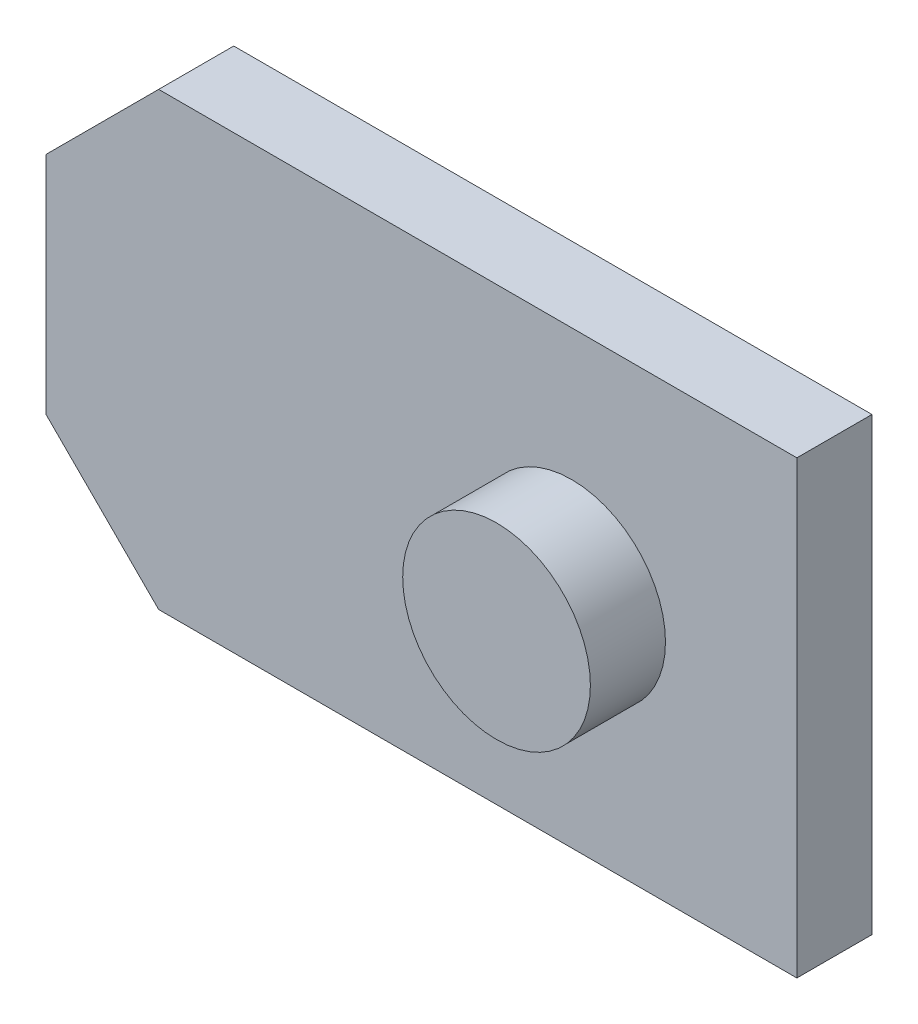
ISO-10303-21;
HEADER;
FILE_DESCRIPTION(('STEP AP214'),'2;1');
FILE_NAME('part.step','',(''),(''),'','','');
FILE_SCHEMA(('AUTOMOTIVE_DESIGN { 1 0 10303 214 1 1 1 1 }'));
ENDSEC;
DATA;
#1=APPLICATION_CONTEXT('core data for automotive mechanical design processes');
#2=APPLICATION_PROTOCOL_DEFINITION('international standard','automotive_design',2000,#1);
#3=PRODUCT_CONTEXT('',#1,'mechanical');
#4=PRODUCT('Part','Part','',(#3));
#5=PRODUCT_RELATED_PRODUCT_CATEGORY('part','',(#4));
#6=PRODUCT_DEFINITION_FORMATION('','',#4);
#7=PRODUCT_DEFINITION_CONTEXT('part definition',#1,'design');
#8=PRODUCT_DEFINITION('design','',#6,#7);
#9=PRODUCT_DEFINITION_SHAPE('','',#8);
#10=(LENGTH_UNIT() NAMED_UNIT(*) SI_UNIT(.MILLI.,.METRE.));
#11=(NAMED_UNIT(*) PLANE_ANGLE_UNIT() SI_UNIT($,.RADIAN.));
#12=(NAMED_UNIT(*) SI_UNIT($,.STERADIAN.) SOLID_ANGLE_UNIT());
#13=UNCERTAINTY_MEASURE_WITH_UNIT(LENGTH_MEASURE(1.E-05),#10,'distance_accuracy_value','');
#14=(GEOMETRIC_REPRESENTATION_CONTEXT(3) GLOBAL_UNCERTAINTY_ASSIGNED_CONTEXT((#13)) GLOBAL_UNIT_ASSIGNED_CONTEXT((#10,
#11,#12)) REPRESENTATION_CONTEXT('',''));
#15=CARTESIAN_POINT('',(0.,0.,0.));
#16=DIRECTION('',(0.,0.,1.));
#17=DIRECTION('',(1.,0.,0.));
#18=AXIS2_PLACEMENT_3D('',#15,#16,#17);
#19=CARTESIAN_POINT('',(-42.4999999999999,-42.5,10.));
#20=DIRECTION('',(0.707106781186546,0.707106781186549,0.));
#21=DIRECTION('',(-0.707106781186549,0.707106781186546,0.));
#22=AXIS2_PLACEMENT_3D('',#19,#20,#21);
#23=PLANE('',#22);
#24=DIRECTION('',(0.707106781186549,-0.707106781186546,0.));
#25=VECTOR('',#24,1.);
#26=CARTESIAN_POINT('',(-42.4999999999999,-42.5,0.));
#27=LINE('',#26,#25);
#28=CARTESIAN_POINT('',(-70.,-15.,0.));
#29=VERTEX_POINT('',#28);
#30=CARTESIAN_POINT('',(-54.9999999999999,-30.,0.));
#31=VERTEX_POINT('',#30);
#32=EDGE_CURVE('E127',#29,#31,#27,.T.);
#33=ORIENTED_EDGE('',*,*,#32,.T.);
#34=DIRECTION('',(0.,0.,-1.));
#35=VECTOR('',#34,1.);
#36=CARTESIAN_POINT('',(-54.9999999999999,-30.,10.));
#37=LINE('',#36,#35);
#38=CARTESIAN_POINT('',(-54.9999999999999,-30.,10.));
#39=VERTEX_POINT('',#38);
#40=EDGE_CURVE('E11',#39,#31,#37,.T.);
#41=ORIENTED_EDGE('',*,*,#40,.F.);
#42=DIRECTION('',(0.707106781186549,-0.707106781186546,0.));
#43=VECTOR('',#42,1.);
#44=CARTESIAN_POINT('',(-42.4999999999999,-42.5,10.));
#45=LINE('',#44,#43);
#46=CARTESIAN_POINT('',(-70.,-15.,10.));
#47=VERTEX_POINT('',#46);
#48=EDGE_CURVE('E140',#47,#39,#45,.T.);
#49=ORIENTED_EDGE('',*,*,#48,.F.);
#50=DIRECTION('',(0.,0.,-1.));
#51=VECTOR('',#50,1.);
#52=CARTESIAN_POINT('',(-70.,-15.,10.));
#53=LINE('',#52,#51);
#54=EDGE_CURVE('E126',#47,#29,#53,.T.);
#55=ORIENTED_EDGE('',*,*,#54,.T.);
#56=EDGE_LOOP('',(#33,#41,#49,#55));
#57=FACE_BOUND('',#56,.T.);
#58=ADVANCED_FACE('F40',(#57),#23,.F.);
#59=CARTESIAN_POINT('',(0.,-30.,10.));
#60=DIRECTION('',(0.,1.,0.));
#61=DIRECTION('',(-1.,0.,0.));
#62=AXIS2_PLACEMENT_3D('',#59,#60,#61);
#63=PLANE('',#62);
#64=DIRECTION('',(1.,0.,0.));
#65=VECTOR('',#64,1.);
#66=CARTESIAN_POINT('',(0.,-30.,0.));
#67=LINE('',#66,#65);
#68=CARTESIAN_POINT('',(30.,-30.,0.));
#69=VERTEX_POINT('',#68);
#70=EDGE_CURVE('E130',#31,#69,#67,.T.);
#71=ORIENTED_EDGE('',*,*,#70,.T.);
#72=DIRECTION('',(0.,0.,-1.));
#73=VECTOR('',#72,1.);
#74=CARTESIAN_POINT('',(30.,-30.,10.));
#75=LINE('',#74,#73);
#76=CARTESIAN_POINT('',(30.,-30.,10.));
#77=VERTEX_POINT('',#76);
#78=EDGE_CURVE('E48',#77,#69,#75,.T.);
#79=ORIENTED_EDGE('',*,*,#78,.F.);
#80=DIRECTION('',(1.,0.,0.));
#81=VECTOR('',#80,1.);
#82=CARTESIAN_POINT('',(0.,-30.,10.));
#83=LINE('',#82,#81);
#84=EDGE_CURVE('E93',#39,#77,#83,.T.);
#85=ORIENTED_EDGE('',*,*,#84,.F.);
#86=ORIENTED_EDGE('',*,*,#40,.T.);
#87=EDGE_LOOP('',(#71,#79,#85,#86));
#88=FACE_BOUND('',#87,.T.);
#89=ADVANCED_FACE('F146',(#88),#63,.F.);
#90=CARTESIAN_POINT('',(30.,0.,10.));
#91=DIRECTION('',(1.,0.,0.));
#92=DIRECTION('',(0.,1.,0.));
#93=AXIS2_PLACEMENT_3D('',#90,#91,#92);
#94=PLANE('',#93);
#95=DIRECTION('',(0.,-1.,0.));
#96=VECTOR('',#95,1.);
#97=CARTESIAN_POINT('',(30.,0.,0.));
#98=LINE('',#97,#96);
#99=CARTESIAN_POINT('',(30.,30.,0.));
#100=VERTEX_POINT('',#99);
#101=EDGE_CURVE('E134',#100,#69,#98,.T.);
#102=ORIENTED_EDGE('',*,*,#101,.F.);
#103=DIRECTION('',(0.,0.,-1.));
#104=VECTOR('',#103,1.);
#105=CARTESIAN_POINT('',(30.,30.,10.));
#106=LINE('',#105,#104);
#107=CARTESIAN_POINT('',(30.,30.,10.));
#108=VERTEX_POINT('',#107);
#109=EDGE_CURVE('E115',#108,#100,#106,.T.);
#110=ORIENTED_EDGE('',*,*,#109,.F.);
#111=DIRECTION('',(0.,-1.,0.));
#112=VECTOR('',#111,1.);
#113=CARTESIAN_POINT('',(30.,0.,10.));
#114=LINE('',#113,#112);
#115=EDGE_CURVE('E108',#108,#77,#114,.T.);
#116=ORIENTED_EDGE('',*,*,#115,.T.);
#117=ORIENTED_EDGE('',*,*,#78,.T.);
#118=EDGE_LOOP('',(#102,#110,#116,#117));
#119=FACE_BOUND('',#118,.T.);
#120=ADVANCED_FACE('F145',(#119),#94,.T.);
#121=CARTESIAN_POINT('',(0.,30.,10.));
#122=DIRECTION('',(0.,-1.,0.));
#123=DIRECTION('',(1.,0.,0.));
#124=AXIS2_PLACEMENT_3D('',#121,#122,#123);
#125=PLANE('',#124);
#126=DIRECTION('',(-1.,0.,0.));
#127=VECTOR('',#126,1.);
#128=CARTESIAN_POINT('',(0.,30.,0.));
#129=LINE('',#128,#127);
#130=CARTESIAN_POINT('',(-54.9999999999999,30.,0.));
#131=VERTEX_POINT('',#130);
#132=EDGE_CURVE('E114',#100,#131,#129,.T.);
#133=ORIENTED_EDGE('',*,*,#132,.T.);
#134=DIRECTION('',(0.,0.,-1.));
#135=VECTOR('',#134,1.);
#136=CARTESIAN_POINT('',(-54.9999999999999,30.,10.));
#137=LINE('',#136,#135);
#138=CARTESIAN_POINT('',(-54.9999999999999,30.,10.));
#139=VERTEX_POINT('',#138);
#140=EDGE_CURVE('E111',#139,#131,#137,.T.);
#141=ORIENTED_EDGE('',*,*,#140,.F.);
#142=DIRECTION('',(-1.,0.,0.));
#143=VECTOR('',#142,1.);
#144=CARTESIAN_POINT('',(0.,30.,10.));
#145=LINE('',#144,#143);
#146=EDGE_CURVE('E101',#108,#139,#145,.T.);
#147=ORIENTED_EDGE('',*,*,#146,.F.);
#148=ORIENTED_EDGE('',*,*,#109,.T.);
#149=EDGE_LOOP('',(#133,#141,#147,#148));
#150=FACE_BOUND('',#149,.T.);
#151=ADVANCED_FACE('F112',(#150),#125,.F.);
#152=CARTESIAN_POINT('',(-42.4999999999999,42.5,10.));
#153=DIRECTION('',(0.707106781186546,-0.707106781186549,0.));
#154=DIRECTION('',(0.707106781186549,0.707106781186546,0.));
#155=AXIS2_PLACEMENT_3D('',#152,#153,#154);
#156=PLANE('',#155);
#157=DIRECTION('',(-0.707106781186549,-0.707106781186546,0.));
#158=VECTOR('',#157,1.);
#159=CARTESIAN_POINT('',(-42.4999999999999,42.5,0.));
#160=LINE('',#159,#158);
#161=CARTESIAN_POINT('',(-70.,15.,0.));
#162=VERTEX_POINT('',#161);
#163=EDGE_CURVE('E79',#131,#162,#160,.T.);
#164=ORIENTED_EDGE('',*,*,#163,.T.);
#165=DIRECTION('',(0.,0.,-1.));
#166=VECTOR('',#165,1.);
#167=CARTESIAN_POINT('',(-70.,15.,10.));
#168=LINE('',#167,#166);
#169=CARTESIAN_POINT('',(-70.,15.,10.));
#170=VERTEX_POINT('',#169);
#171=EDGE_CURVE('E116',#170,#162,#168,.T.);
#172=ORIENTED_EDGE('',*,*,#171,.F.);
#173=DIRECTION('',(-0.707106781186549,-0.707106781186546,0.));
#174=VECTOR('',#173,1.);
#175=CARTESIAN_POINT('',(-42.4999999999999,42.5,10.));
#176=LINE('',#175,#174);
#177=EDGE_CURVE('E106',#139,#170,#176,.T.);
#178=ORIENTED_EDGE('',*,*,#177,.F.);
#179=ORIENTED_EDGE('',*,*,#140,.T.);
#180=EDGE_LOOP('',(#164,#172,#178,#179));
#181=FACE_BOUND('',#180,.T.);
#182=ADVANCED_FACE('F118',(#181),#156,.F.);
#183=CARTESIAN_POINT('',(-70.,0.,10.));
#184=DIRECTION('',(1.,0.,0.));
#185=DIRECTION('',(0.,0.,-1.));
#186=AXIS2_PLACEMENT_3D('',#183,#184,#185);
#187=PLANE('',#186);
#188=DIRECTION('',(0.,-1.,0.));
#189=VECTOR('',#188,1.);
#190=CARTESIAN_POINT('',(-70.,0.,0.));
#191=LINE('',#190,#189);
#192=EDGE_CURVE('E85',#162,#29,#191,.T.);
#193=ORIENTED_EDGE('',*,*,#192,.T.);
#194=ORIENTED_EDGE('',*,*,#54,.F.);
#195=DIRECTION('',(0.,-1.,0.));
#196=VECTOR('',#195,1.);
#197=CARTESIAN_POINT('',(-70.,0.,10.));
#198=LINE('',#197,#196);
#199=EDGE_CURVE('E56',#170,#47,#198,.T.);
#200=ORIENTED_EDGE('',*,*,#199,.F.);
#201=ORIENTED_EDGE('',*,*,#171,.T.);
#202=EDGE_LOOP('',(#193,#194,#200,#201));
#203=FACE_BOUND('',#202,.T.);
#204=ADVANCED_FACE('F153',(#203),#187,.F.);
#205=CARTESIAN_POINT('',(0.,0.,10.));
#206=DIRECTION('',(0.,0.,1.));
#207=DIRECTION('',(1.,0.,0.));
#208=AXIS2_PLACEMENT_3D('',#205,#206,#207);
#209=PLANE('',#208);
#210=ORIENTED_EDGE('',*,*,#48,.T.);
#211=ORIENTED_EDGE('',*,*,#84,.T.);
#212=ORIENTED_EDGE('',*,*,#115,.F.);
#213=ORIENTED_EDGE('',*,*,#146,.T.);
#214=ORIENTED_EDGE('',*,*,#177,.T.);
#215=ORIENTED_EDGE('',*,*,#199,.T.);
#216=EDGE_LOOP('',(#210,#211,#212,#213,#214,#215));
#217=FACE_BOUND('',#216,.T.);
#218=CARTESIAN_POINT('',(0.,0.,10.));
#219=DIRECTION('',(0.,0.,1.));
#220=DIRECTION('',(1.,0.,0.));
#221=AXIS2_PLACEMENT_3D('',#218,#219,#220);
#222=CIRCLE('',#221,12.5);
#223=CARTESIAN_POINT('',(12.5,0.,10.));
#224=VERTEX_POINT('',#223);
#225=EDGE_CURVE('E120',#224,#224,#222,.T.);
#226=ORIENTED_EDGE('',*,*,#225,.F.);
#227=EDGE_LOOP('',(#226));
#228=FACE_BOUND('',#227,.T.);
#229=ADVANCED_FACE('F103',(#217,#228),#209,.T.);
#230=CARTESIAN_POINT('',(0.,0.,0.));
#231=DIRECTION('',(0.,0.,1.));
#232=DIRECTION('',(1.,0.,0.));
#233=AXIS2_PLACEMENT_3D('',#230,#231,#232);
#234=PLANE('',#233);
#235=ORIENTED_EDGE('',*,*,#32,.F.);
#236=ORIENTED_EDGE('',*,*,#192,.F.);
#237=ORIENTED_EDGE('',*,*,#163,.F.);
#238=ORIENTED_EDGE('',*,*,#132,.F.);
#239=ORIENTED_EDGE('',*,*,#101,.T.);
#240=ORIENTED_EDGE('',*,*,#70,.F.);
#241=EDGE_LOOP('',(#235,#236,#237,#238,#239,#240));
#242=FACE_BOUND('',#241,.T.);
#243=ADVANCED_FACE('F150',(#242),#234,.F.);
#244=CARTESIAN_POINT('',(0.,0.,20.));
#245=DIRECTION('',(0.,0.,-1.));
#246=DIRECTION('',(-1.,0.,0.));
#247=AXIS2_PLACEMENT_3D('',#244,#245,#246);
#248=CYLINDRICAL_SURFACE('',#247,12.5);
#249=ORIENTED_EDGE('',*,*,#225,.T.);
#250=EDGE_LOOP('',(#249));
#251=FACE_BOUND('',#250,.T.);
#252=CARTESIAN_POINT('',(0.,0.,20.));
#253=DIRECTION('',(0.,0.,1.));
#254=DIRECTION('',(1.,0.,0.));
#255=AXIS2_PLACEMENT_3D('',#252,#253,#254);
#256=CIRCLE('',#255,12.5);
#257=CARTESIAN_POINT('',(12.5,0.,20.));
#258=VERTEX_POINT('',#257);
#259=EDGE_CURVE('E131',#258,#258,#256,.T.);
#260=ORIENTED_EDGE('',*,*,#259,.F.);
#261=EDGE_LOOP('',(#260));
#262=FACE_BOUND('',#261,.T.);
#263=ADVANCED_FACE('F204',(#251,#262),#248,.T.);
#264=CARTESIAN_POINT('',(0.,0.,20.));
#265=DIRECTION('',(0.,0.,1.));
#266=DIRECTION('',(1.,0.,0.));
#267=AXIS2_PLACEMENT_3D('',#264,#265,#266);
#268=PLANE('',#267);
#269=ORIENTED_EDGE('',*,*,#259,.T.);
#270=EDGE_LOOP('',(#269));
#271=FACE_BOUND('',#270,.T.);
#272=ADVANCED_FACE('F213',(#271),#268,.T.);
#273=CLOSED_SHELL('',(#58,#89,#120,#151,#182,#204,#229,#243,#263,#272));
#274=MANIFOLD_SOLID_BREP('B2',#273);
#275=ADVANCED_BREP_SHAPE_REPRESENTATION('',(#18,#274),#14);
#276=SHAPE_DEFINITION_REPRESENTATION(#9,#275);
ENDSEC;
END-ISO-10303-21;
